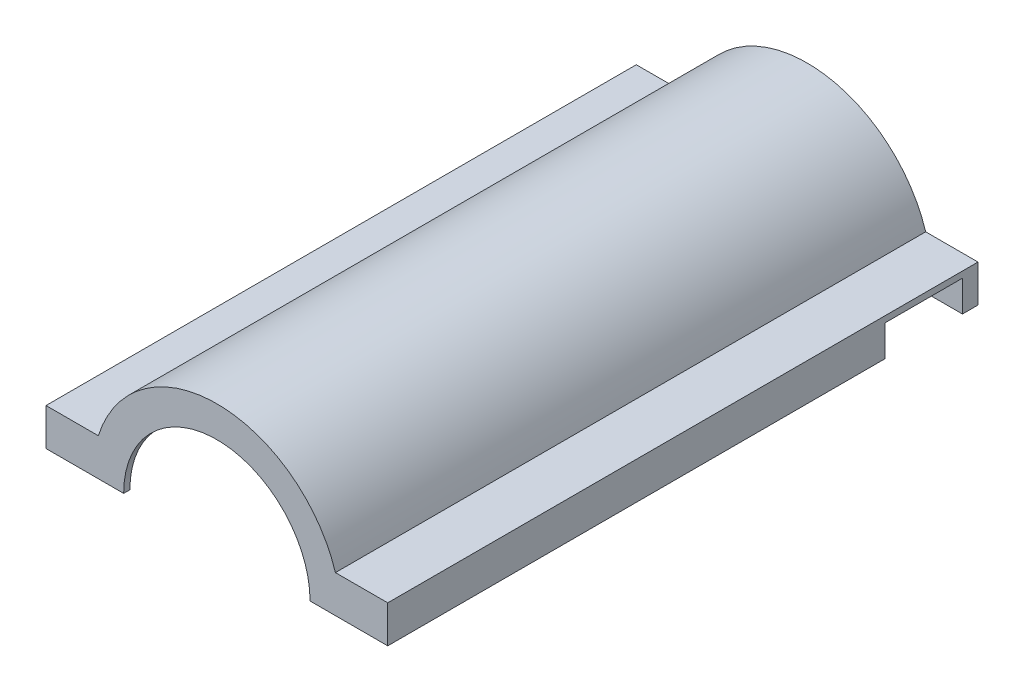
ISO-10303-21;
HEADER;
FILE_DESCRIPTION(('STEP AP214'),'2;1');
FILE_NAME('part.step','',(''),(''),'','','');
FILE_SCHEMA(('AUTOMOTIVE_DESIGN { 1 0 10303 214 1 1 1 1 }'));
ENDSEC;
DATA;
#1=APPLICATION_CONTEXT('core data for automotive mechanical design processes');
#2=APPLICATION_PROTOCOL_DEFINITION('international standard','automotive_design',2000,#1);
#3=PRODUCT_CONTEXT('',#1,'mechanical');
#4=PRODUCT('Part','Part','',(#3));
#5=PRODUCT_RELATED_PRODUCT_CATEGORY('part','',(#4));
#6=PRODUCT_DEFINITION_FORMATION('','',#4);
#7=PRODUCT_DEFINITION_CONTEXT('part definition',#1,'design');
#8=PRODUCT_DEFINITION('design','',#6,#7);
#9=PRODUCT_DEFINITION_SHAPE('','',#8);
#10=(LENGTH_UNIT() NAMED_UNIT(*) SI_UNIT(.MILLI.,.METRE.));
#11=(NAMED_UNIT(*) PLANE_ANGLE_UNIT() SI_UNIT($,.RADIAN.));
#12=(NAMED_UNIT(*) SI_UNIT($,.STERADIAN.) SOLID_ANGLE_UNIT());
#13=UNCERTAINTY_MEASURE_WITH_UNIT(LENGTH_MEASURE(1.E-05),#10,'distance_accuracy_value','');
#14=(GEOMETRIC_REPRESENTATION_CONTEXT(3) GLOBAL_UNCERTAINTY_ASSIGNED_CONTEXT((#13)) GLOBAL_UNIT_ASSIGNED_CONTEXT((#10,
#11,#12)) REPRESENTATION_CONTEXT('',''));
#15=CARTESIAN_POINT('',(0.,0.,0.));
#16=DIRECTION('',(0.,0.,1.));
#17=DIRECTION('',(1.,0.,0.));
#18=AXIS2_PLACEMENT_3D('',#15,#16,#17);
#19=CARTESIAN_POINT('',(0.,0.,1900.));
#20=DIRECTION('',(0.,1.,0.));
#21=DIRECTION('',(0.,0.,1.));
#22=AXIS2_PLACEMENT_3D('',#19,#20,#21);
#23=PLANE('',#22);
#24=DIRECTION('',(1.,0.,0.));
#25=VECTOR('',#24,1.);
#26=CARTESIAN_POINT('',(0.,0.,20.));
#27=LINE('',#26,#25);
#28=CARTESIAN_POINT('',(20.,0.,20.));
#29=VERTEX_POINT('',#28);
#30=CARTESIAN_POINT('',(250.,0.,20.));
#31=VERTEX_POINT('',#30);
#32=EDGE_CURVE('E48',#29,#31,#27,.T.);
#33=ORIENTED_EDGE('',*,*,#32,.F.);
#34=DIRECTION('',(0.,0.,-1.));
#35=VECTOR('',#34,1.);
#36=CARTESIAN_POINT('',(20.,0.,1900.));
#37=LINE('',#36,#35);
#38=CARTESIAN_POINT('',(20.,0.,1880.));
#39=VERTEX_POINT('',#38);
#40=EDGE_CURVE('E230',#39,#29,#37,.T.);
#41=ORIENTED_EDGE('',*,*,#40,.F.);
#42=DIRECTION('',(1.,0.,0.));
#43=VECTOR('',#42,1.);
#44=CARTESIAN_POINT('',(0.,0.,1880.));
#45=LINE('',#44,#43);
#46=CARTESIAN_POINT('',(250.,0.,1880.));
#47=VERTEX_POINT('',#46);
#48=EDGE_CURVE('E267',#39,#47,#45,.T.);
#49=ORIENTED_EDGE('',*,*,#48,.T.);
#50=DIRECTION('',(0.,0.,1.));
#51=VECTOR('',#50,1.);
#52=CARTESIAN_POINT('',(250.,0.,0.));
#53=LINE('',#52,#51);
#54=CARTESIAN_POINT('',(250.,0.,1900.));
#55=VERTEX_POINT('',#54);
#56=EDGE_CURVE('E339',#47,#55,#53,.T.);
#57=ORIENTED_EDGE('',*,*,#56,.T.);
#58=DIRECTION('',(1.,0.,0.));
#59=VECTOR('',#58,1.);
#60=CARTESIAN_POINT('',(0.,0.,1900.));
#61=LINE('',#60,#59);
#62=CARTESIAN_POINT('',(0.,0.,1900.));
#63=VERTEX_POINT('',#62);
#64=EDGE_CURVE('E351',#63,#55,#61,.T.);
#65=ORIENTED_EDGE('',*,*,#64,.F.);
#66=DIRECTION('',(0.,0.,-1.));
#67=VECTOR('',#66,1.);
#68=CARTESIAN_POINT('',(0.,0.,1900.));
#69=LINE('',#68,#67);
#70=CARTESIAN_POINT('',(0.,0.,0.));
#71=VERTEX_POINT('',#70);
#72=EDGE_CURVE('E391',#63,#71,#69,.T.);
#73=ORIENTED_EDGE('',*,*,#72,.T.);
#74=DIRECTION('',(1.,0.,0.));
#75=VECTOR('',#74,1.);
#76=CARTESIAN_POINT('',(0.,0.,0.));
#77=LINE('',#76,#75);
#78=CARTESIAN_POINT('',(250.,0.,0.));
#79=VERTEX_POINT('',#78);
#80=EDGE_CURVE('E366',#71,#79,#77,.T.);
#81=ORIENTED_EDGE('',*,*,#80,.T.);
#82=EDGE_CURVE('E342',#79,#31,#53,.T.);
#83=ORIENTED_EDGE('',*,*,#82,.T.);
#84=EDGE_LOOP('',(#33,#41,#49,#57,#65,#73,#81,#83));
#85=FACE_BOUND('',#84,.T.);
#86=ADVANCED_FACE('F33',(#85),#23,.F.);
#87=DIRECTION('',(1.,0.,0.));
#88=VECTOR('',#87,1.);
#89=CARTESIAN_POINT('',(0.,0.,320.));
#90=LINE('',#89,#88);
#91=CARTESIAN_POINT('',(850.,0.,320.));
#92=VERTEX_POINT('',#91);
#93=CARTESIAN_POINT('',(1080.,0.,320.));
#94=VERTEX_POINT('',#93);
#95=EDGE_CURVE('E275',#92,#94,#90,.T.);
#96=ORIENTED_EDGE('',*,*,#95,.F.);
#97=DIRECTION('',(0.,0.,1.));
#98=VECTOR('',#97,1.);
#99=CARTESIAN_POINT('',(850.,0.,0.));
#100=LINE('',#99,#98);
#101=CARTESIAN_POINT('',(850.,0.,300.));
#102=VERTEX_POINT('',#101);
#103=EDGE_CURVE('E340',#92,#102,#100,.F.);
#104=ORIENTED_EDGE('',*,*,#103,.T.);
#105=DIRECTION('',(1.,0.,0.));
#106=VECTOR('',#105,1.);
#107=CARTESIAN_POINT('',(550.,0.,300.));
#108=LINE('',#107,#106);
#109=CARTESIAN_POINT('',(1100.,0.,300.));
#110=VERTEX_POINT('',#109);
#111=EDGE_CURVE('E325',#102,#110,#108,.T.);
#112=ORIENTED_EDGE('',*,*,#111,.T.);
#113=DIRECTION('',(0.,0.,-1.));
#114=VECTOR('',#113,1.);
#115=CARTESIAN_POINT('',(1100.,0.,1900.));
#116=LINE('',#115,#114);
#117=CARTESIAN_POINT('',(1100.,0.,1900.));
#118=VERTEX_POINT('',#117);
#119=EDGE_CURVE('E388',#118,#110,#116,.T.);
#120=ORIENTED_EDGE('',*,*,#119,.F.);
#121=CARTESIAN_POINT('',(850.,0.,1900.));
#122=VERTEX_POINT('',#121);
#123=EDGE_CURVE('E349',#122,#118,#61,.T.);
#124=ORIENTED_EDGE('',*,*,#123,.F.);
#125=CARTESIAN_POINT('',(850.,0.,1880.));
#126=VERTEX_POINT('',#125);
#127=EDGE_CURVE('E336',#122,#126,#100,.F.);
#128=ORIENTED_EDGE('',*,*,#127,.T.);
#129=DIRECTION('',(1.,0.,0.));
#130=VECTOR('',#129,1.);
#131=CARTESIAN_POINT('',(0.,0.,1880.));
#132=LINE('',#131,#130);
#133=CARTESIAN_POINT('',(1080.,0.,1880.));
#134=VERTEX_POINT('',#133);
#135=EDGE_CURVE('E238',#126,#134,#132,.T.);
#136=ORIENTED_EDGE('',*,*,#135,.T.);
#137=DIRECTION('',(0.,0.,-1.));
#138=VECTOR('',#137,1.);
#139=CARTESIAN_POINT('',(1080.,0.,1900.));
#140=LINE('',#139,#138);
#141=EDGE_CURVE('E278',#134,#94,#140,.T.);
#142=ORIENTED_EDGE('',*,*,#141,.T.);
#143=EDGE_LOOP('',(#96,#104,#112,#120,#124,#128,#136,#142));
#144=FACE_BOUND('',#143,.T.);
#145=ADVANCED_FACE('F409',(#144),#23,.F.);
#146=CARTESIAN_POINT('',(550.,0.,0.));
#147=DIRECTION('',(0.,0.,1.));
#148=DIRECTION('',(1.,0.,0.));
#149=AXIS2_PLACEMENT_3D('',#146,#147,#148);
#150=CYLINDRICAL_SURFACE('',#149,300.);
#151=CARTESIAN_POINT('',(550.,0.,30.));
#152=DIRECTION('',(0.,0.,-1.));
#153=DIRECTION('',(0.,1.,0.));
#154=AXIS2_PLACEMENT_3D('',#151,#152,#153);
#155=CIRCLE('',#154,300.);
#156=CARTESIAN_POINT('',(850.,0.,30.));
#157=VERTEX_POINT('',#156);
#158=CARTESIAN_POINT('',(824.95454169735,120.,30.));
#159=VERTEX_POINT('',#158);
#160=EDGE_CURVE('E285',#157,#159,#155,.F.);
#161=ORIENTED_EDGE('',*,*,#160,.F.);
#162=CARTESIAN_POINT('',(850.,0.,50.));
#163=VERTEX_POINT('',#162);
#164=EDGE_CURVE('E341',#163,#157,#100,.F.);
#165=ORIENTED_EDGE('',*,*,#164,.F.);
#166=CARTESIAN_POINT('',(550.,0.,50.));
#167=DIRECTION('',(0.,0.,-1.));
#168=DIRECTION('',(0.,1.,0.));
#169=AXIS2_PLACEMENT_3D('',#166,#167,#168);
#170=CIRCLE('',#169,300.);
#171=CARTESIAN_POINT('',(832.842712474619,100.,50.));
#172=VERTEX_POINT('',#171);
#173=EDGE_CURVE('E11',#163,#172,#170,.F.);
#174=ORIENTED_EDGE('',*,*,#173,.T.);
#175=DIRECTION('',(0.,0.,1.));
#176=VECTOR('',#175,1.);
#177=CARTESIAN_POINT('',(832.842712474619,100.,0.));
#178=LINE('',#177,#176);
#179=CARTESIAN_POINT('',(832.842712474619,100.,300.));
#180=VERTEX_POINT('',#179);
#181=EDGE_CURVE('E394',#172,#180,#178,.T.);
#182=ORIENTED_EDGE('',*,*,#181,.T.);
#183=CARTESIAN_POINT('',(550.,0.,300.));
#184=DIRECTION('',(0.,0.,1.));
#185=DIRECTION('',(1.,0.,0.));
#186=AXIS2_PLACEMENT_3D('',#183,#184,#185);
#187=CIRCLE('',#186,300.);
#188=EDGE_CURVE('E41',#180,#102,#187,.F.);
#189=ORIENTED_EDGE('',*,*,#188,.T.);
#190=ORIENTED_EDGE('',*,*,#103,.F.);
#191=CARTESIAN_POINT('',(550.,0.,320.));
#192=DIRECTION('',(0.,0.,1.));
#193=DIRECTION('',(1.,0.,0.));
#194=AXIS2_PLACEMENT_3D('',#191,#192,#193);
#195=CIRCLE('',#194,300.);
#196=CARTESIAN_POINT('',(824.95454169735,120.,320.));
#197=VERTEX_POINT('',#196);
#198=EDGE_CURVE('E289',#197,#92,#195,.F.);
#199=ORIENTED_EDGE('',*,*,#198,.F.);
#200=DIRECTION('',(0.,0.,1.));
#201=VECTOR('',#200,1.);
#202=CARTESIAN_POINT('',(824.95454169735,120.,30.));
#203=LINE('',#202,#201);
#204=EDGE_CURVE('E277',#159,#197,#203,.T.);
#205=ORIENTED_EDGE('',*,*,#204,.F.);
#206=EDGE_LOOP('',(#161,#165,#174,#182,#189,#190,#199,#205));
#207=FACE_BOUND('',#206,.T.);
#208=ADVANCED_FACE('F400',(#207),#150,.F.);
#209=CARTESIAN_POINT('',(550.,0.,1880.));
#210=DIRECTION('',(0.,0.,1.));
#211=DIRECTION('',(1.,0.,0.));
#212=AXIS2_PLACEMENT_3D('',#209,#210,#211);
#213=CIRCLE('',#212,300.);
#214=EDGE_CURVE('E235',#126,#47,#213,.T.);
#215=ORIENTED_EDGE('',*,*,#214,.F.);
#216=ORIENTED_EDGE('',*,*,#127,.F.);
#217=CARTESIAN_POINT('',(550.,0.,1900.));
#218=DIRECTION('',(0.,0.,1.));
#219=DIRECTION('',(1.,0.,0.));
#220=AXIS2_PLACEMENT_3D('',#217,#218,#219);
#221=CIRCLE('',#220,300.);
#222=EDGE_CURVE('E324',#122,#55,#221,.T.);
#223=ORIENTED_EDGE('',*,*,#222,.T.);
#224=ORIENTED_EDGE('',*,*,#56,.F.);
#225=EDGE_LOOP('',(#215,#216,#223,#224));
#226=FACE_BOUND('',#225,.T.);
#227=ADVANCED_FACE('F423',(#226),#150,.F.);
#228=ORIENTED_EDGE('',*,*,#164,.T.);
#229=DIRECTION('',(1.,0.,0.));
#230=VECTOR('',#229,1.);
#231=CARTESIAN_POINT('',(550.,0.,30.));
#232=LINE('',#231,#230);
#233=CARTESIAN_POINT('',(1080.,0.,30.));
#234=VERTEX_POINT('',#233);
#235=EDGE_CURVE('E282',#157,#234,#232,.T.);
#236=ORIENTED_EDGE('',*,*,#235,.T.);
#237=DIRECTION('',(0.,0.,-1.));
#238=VECTOR('',#237,1.);
#239=CARTESIAN_POINT('',(1080.,0.,1900.));
#240=LINE('',#239,#238);
#241=CARTESIAN_POINT('',(1080.,0.,20.));
#242=VERTEX_POINT('',#241);
#243=EDGE_CURVE('E259',#234,#242,#240,.T.);
#244=ORIENTED_EDGE('',*,*,#243,.T.);
#245=DIRECTION('',(1.,0.,0.));
#246=VECTOR('',#245,1.);
#247=CARTESIAN_POINT('',(0.,0.,20.));
#248=LINE('',#247,#246);
#249=CARTESIAN_POINT('',(850.,0.,20.));
#250=VERTEX_POINT('',#249);
#251=EDGE_CURVE('E231',#250,#242,#248,.T.);
#252=ORIENTED_EDGE('',*,*,#251,.F.);
#253=CARTESIAN_POINT('',(850.,0.,0.));
#254=VERTEX_POINT('',#253);
#255=EDGE_CURVE('E333',#250,#254,#100,.F.);
#256=ORIENTED_EDGE('',*,*,#255,.T.);
#257=CARTESIAN_POINT('',(1100.,0.,0.));
#258=VERTEX_POINT('',#257);
#259=EDGE_CURVE('E365',#254,#258,#77,.T.);
#260=ORIENTED_EDGE('',*,*,#259,.T.);
#261=CARTESIAN_POINT('',(1100.,0.,50.));
#262=VERTEX_POINT('',#261);
#263=EDGE_CURVE('E387',#262,#258,#116,.T.);
#264=ORIENTED_EDGE('',*,*,#263,.F.);
#265=DIRECTION('',(1.,0.,0.));
#266=VECTOR('',#265,1.);
#267=CARTESIAN_POINT('',(550.,0.,50.));
#268=LINE('',#267,#266);
#269=EDGE_CURVE('E322',#163,#262,#268,.T.);
#270=ORIENTED_EDGE('',*,*,#269,.F.);
#271=EDGE_LOOP('',(#228,#236,#244,#252,#256,#260,#264,#270));
#272=FACE_BOUND('',#271,.T.);
#273=ADVANCED_FACE('F443',(#272),#23,.F.);
#274=CARTESIAN_POINT('',(0.,0.,1900.));
#275=DIRECTION('',(1.,0.,0.));
#276=DIRECTION('',(0.,0.,-1.));
#277=AXIS2_PLACEMENT_3D('',#274,#275,#276);
#278=PLANE('',#277);
#279=DIRECTION('',(0.,-1.,0.));
#280=VECTOR('',#279,1.);
#281=CARTESIAN_POINT('',(0.,0.,0.));
#282=LINE('',#281,#280);
#283=CARTESIAN_POINT('',(0.,120.,0.));
#284=VERTEX_POINT('',#283);
#285=EDGE_CURVE('E345',#284,#71,#282,.T.);
#286=ORIENTED_EDGE('',*,*,#285,.T.);
#287=ORIENTED_EDGE('',*,*,#72,.F.);
#288=DIRECTION('',(0.,-1.,0.));
#289=VECTOR('',#288,1.);
#290=CARTESIAN_POINT('',(0.,0.,1900.));
#291=LINE('',#290,#289);
#292=CARTESIAN_POINT('',(0.,120.,1900.));
#293=VERTEX_POINT('',#292);
#294=EDGE_CURVE('E346',#293,#63,#291,.T.);
#295=ORIENTED_EDGE('',*,*,#294,.F.);
#296=DIRECTION('',(0.,0.,-1.));
#297=VECTOR('',#296,1.);
#298=CARTESIAN_POINT('',(0.,120.,1900.));
#299=LINE('',#298,#297);
#300=EDGE_CURVE('E362',#293,#284,#299,.T.);
#301=ORIENTED_EDGE('',*,*,#300,.T.);
#302=EDGE_LOOP('',(#286,#287,#295,#301));
#303=FACE_BOUND('',#302,.T.);
#304=ADVANCED_FACE('F35',(#303),#278,.F.);
#305=CARTESIAN_POINT('',(1100.,0.,1900.));
#306=DIRECTION('',(-1.,0.,0.));
#307=DIRECTION('',(0.,0.,1.));
#308=AXIS2_PLACEMENT_3D('',#305,#306,#307);
#309=PLANE('',#308);
#310=DIRECTION('',(0.,0.,1.));
#311=VECTOR('',#310,1.);
#312=CARTESIAN_POINT('',(1100.,100.,50.));
#313=LINE('',#312,#311);
#314=CARTESIAN_POINT('',(1100.,100.,50.));
#315=VERTEX_POINT('',#314);
#316=CARTESIAN_POINT('',(1100.,100.,300.));
#317=VERTEX_POINT('',#316);
#318=EDGE_CURVE('E317',#315,#317,#313,.T.);
#319=ORIENTED_EDGE('',*,*,#318,.F.);
#320=DIRECTION('',(0.,1.,0.));
#321=VECTOR('',#320,1.);
#322=CARTESIAN_POINT('',(1100.,0.,50.));
#323=LINE('',#322,#321);
#324=EDGE_CURVE('E314',#262,#315,#323,.T.);
#325=ORIENTED_EDGE('',*,*,#324,.F.);
#326=ORIENTED_EDGE('',*,*,#263,.T.);
#327=DIRECTION('',(0.,1.,0.));
#328=VECTOR('',#327,1.);
#329=CARTESIAN_POINT('',(1100.,0.,0.));
#330=LINE('',#329,#328);
#331=CARTESIAN_POINT('',(1100.,120.,0.));
#332=VERTEX_POINT('',#331);
#333=EDGE_CURVE('E369',#258,#332,#330,.T.);
#334=ORIENTED_EDGE('',*,*,#333,.T.);
#335=DIRECTION('',(0.,0.,-1.));
#336=VECTOR('',#335,1.);
#337=CARTESIAN_POINT('',(1100.,120.,1900.));
#338=LINE('',#337,#336);
#339=CARTESIAN_POINT('',(1100.,120.,1900.));
#340=VERTEX_POINT('',#339);
#341=EDGE_CURVE('E384',#340,#332,#338,.T.);
#342=ORIENTED_EDGE('',*,*,#341,.F.);
#343=DIRECTION('',(0.,1.,0.));
#344=VECTOR('',#343,1.);
#345=CARTESIAN_POINT('',(1100.,0.,1900.));
#346=LINE('',#345,#344);
#347=EDGE_CURVE('E354',#118,#340,#346,.T.);
#348=ORIENTED_EDGE('',*,*,#347,.F.);
#349=ORIENTED_EDGE('',*,*,#119,.T.);
#350=DIRECTION('',(0.,-1.,0.));
#351=VECTOR('',#350,1.);
#352=CARTESIAN_POINT('',(1100.,0.,300.));
#353=LINE('',#352,#351);
#354=EDGE_CURVE('E319',#317,#110,#353,.T.);
#355=ORIENTED_EDGE('',*,*,#354,.F.);
#356=EDGE_LOOP('',(#319,#325,#326,#334,#342,#348,#349,#355));
#357=FACE_BOUND('',#356,.T.);
#358=ADVANCED_FACE('F414',(#357),#309,.F.);
#359=CARTESIAN_POINT('',(931.575680566778,120.,1900.));
#360=DIRECTION('',(0.,-1.,0.));
#361=DIRECTION('',(0.,0.,-1.));
#362=AXIS2_PLACEMENT_3D('',#359,#360,#361);
#363=PLANE('',#362);
#364=DIRECTION('',(-1.,0.,0.));
#365=VECTOR('',#364,1.);
#366=CARTESIAN_POINT('',(931.575680566778,120.,0.));
#367=LINE('',#366,#365);
#368=CARTESIAN_POINT('',(931.575680566778,120.,0.));
#369=VERTEX_POINT('',#368);
#370=EDGE_CURVE('E371',#332,#369,#367,.T.);
#371=ORIENTED_EDGE('',*,*,#370,.T.);
#372=DIRECTION('',(0.,0.,-1.));
#373=VECTOR('',#372,1.);
#374=CARTESIAN_POINT('',(931.575680566778,120.,1900.));
#375=LINE('',#374,#373);
#376=CARTESIAN_POINT('',(931.575680566778,120.,1900.));
#377=VERTEX_POINT('',#376);
#378=EDGE_CURVE('E381',#377,#369,#375,.T.);
#379=ORIENTED_EDGE('',*,*,#378,.F.);
#380=DIRECTION('',(-1.,0.,0.));
#381=VECTOR('',#380,1.);
#382=CARTESIAN_POINT('',(931.575680566778,120.,1900.));
#383=LINE('',#382,#381);
#384=EDGE_CURVE('E356',#340,#377,#383,.T.);
#385=ORIENTED_EDGE('',*,*,#384,.F.);
#386=ORIENTED_EDGE('',*,*,#341,.T.);
#387=EDGE_LOOP('',(#371,#379,#385,#386));
#388=FACE_BOUND('',#387,.T.);
#389=ADVANCED_FACE('F520',(#388),#363,.F.);
#390=CARTESIAN_POINT('',(550.,0.,1900.));
#391=DIRECTION('',(0.,0.,-1.));
#392=DIRECTION('',(-1.,0.,0.));
#393=AXIS2_PLACEMENT_3D('',#390,#391,#392);
#394=CYLINDRICAL_SURFACE('',#393,400.);
#395=CARTESIAN_POINT('',(550.,0.,0.));
#396=DIRECTION('',(0.,0.,1.));
#397=DIRECTION('',(1.,0.,0.));
#398=AXIS2_PLACEMENT_3D('',#395,#396,#397);
#399=CIRCLE('',#398,400.);
#400=CARTESIAN_POINT('',(168.424319433222,120.,0.));
#401=VERTEX_POINT('',#400);
#402=EDGE_CURVE('E373',#369,#401,#399,.T.);
#403=ORIENTED_EDGE('',*,*,#402,.T.);
#404=DIRECTION('',(0.,0.,-1.));
#405=VECTOR('',#404,1.);
#406=CARTESIAN_POINT('',(168.424319433222,120.,1900.));
#407=LINE('',#406,#405);
#408=CARTESIAN_POINT('',(168.424319433222,120.,1900.));
#409=VERTEX_POINT('',#408);
#410=EDGE_CURVE('E378',#409,#401,#407,.T.);
#411=ORIENTED_EDGE('',*,*,#410,.F.);
#412=CARTESIAN_POINT('',(550.,0.,1900.));
#413=DIRECTION('',(0.,0.,1.));
#414=DIRECTION('',(1.,0.,0.));
#415=AXIS2_PLACEMENT_3D('',#412,#413,#414);
#416=CIRCLE('',#415,400.);
#417=EDGE_CURVE('E358',#377,#409,#416,.T.);
#418=ORIENTED_EDGE('',*,*,#417,.F.);
#419=ORIENTED_EDGE('',*,*,#378,.T.);
#420=EDGE_LOOP('',(#403,#411,#418,#419));
#421=FACE_BOUND('',#420,.T.);
#422=ADVANCED_FACE('F516',(#421),#394,.T.);
#423=CARTESIAN_POINT('',(0.,120.,1900.));
#424=DIRECTION('',(0.,-1.,0.));
#425=DIRECTION('',(0.,0.,-1.));
#426=AXIS2_PLACEMENT_3D('',#423,#424,#425);
#427=PLANE('',#426);
#428=DIRECTION('',(-1.,0.,0.));
#429=VECTOR('',#428,1.);
#430=CARTESIAN_POINT('',(0.,120.,0.));
#431=LINE('',#430,#429);
#432=EDGE_CURVE('E350',#401,#284,#431,.T.);
#433=ORIENTED_EDGE('',*,*,#432,.T.);
#434=ORIENTED_EDGE('',*,*,#300,.F.);
#435=DIRECTION('',(-1.,0.,0.));
#436=VECTOR('',#435,1.);
#437=CARTESIAN_POINT('',(0.,120.,1900.));
#438=LINE('',#437,#436);
#439=EDGE_CURVE('E360',#409,#293,#438,.T.);
#440=ORIENTED_EDGE('',*,*,#439,.F.);
#441=ORIENTED_EDGE('',*,*,#410,.T.);
#442=EDGE_LOOP('',(#433,#434,#440,#441));
#443=FACE_BOUND('',#442,.T.);
#444=ADVANCED_FACE('F512',(#443),#427,.F.);
#445=CARTESIAN_POINT('',(550.,0.,1900.));
#446=DIRECTION('',(0.,0.,1.));
#447=DIRECTION('',(1.,0.,0.));
#448=AXIS2_PLACEMENT_3D('',#445,#446,#447);
#449=PLANE('',#448);
#450=ORIENTED_EDGE('',*,*,#222,.F.);
#451=ORIENTED_EDGE('',*,*,#123,.T.);
#452=ORIENTED_EDGE('',*,*,#347,.T.);
#453=ORIENTED_EDGE('',*,*,#384,.T.);
#454=ORIENTED_EDGE('',*,*,#417,.T.);
#455=ORIENTED_EDGE('',*,*,#439,.T.);
#456=ORIENTED_EDGE('',*,*,#294,.T.);
#457=ORIENTED_EDGE('',*,*,#64,.T.);
#458=EDGE_LOOP('',(#450,#451,#452,#453,#454,#455,#456,#457));
#459=FACE_BOUND('',#458,.T.);
#460=ADVANCED_FACE('F419',(#459),#449,.T.);
#461=CARTESIAN_POINT('',(550.,0.,0.));
#462=DIRECTION('',(0.,0.,1.));
#463=DIRECTION('',(1.,0.,0.));
#464=AXIS2_PLACEMENT_3D('',#461,#462,#463);
#465=PLANE('',#464);
#466=ORIENTED_EDGE('',*,*,#259,.F.);
#467=CARTESIAN_POINT('',(550.,0.,0.));
#468=DIRECTION('',(0.,0.,1.));
#469=DIRECTION('',(1.,0.,0.));
#470=AXIS2_PLACEMENT_3D('',#467,#468,#469);
#471=CIRCLE('',#470,300.);
#472=EDGE_CURVE('E330',#254,#79,#471,.T.);
#473=ORIENTED_EDGE('',*,*,#472,.T.);
#474=ORIENTED_EDGE('',*,*,#80,.F.);
#475=ORIENTED_EDGE('',*,*,#285,.F.);
#476=ORIENTED_EDGE('',*,*,#432,.F.);
#477=ORIENTED_EDGE('',*,*,#402,.F.);
#478=ORIENTED_EDGE('',*,*,#370,.F.);
#479=ORIENTED_EDGE('',*,*,#333,.F.);
#480=EDGE_LOOP('',(#466,#473,#474,#475,#476,#477,#478,#479));
#481=FACE_BOUND('',#480,.T.);
#482=ADVANCED_FACE('F435',(#481),#465,.F.);
#483=ORIENTED_EDGE('',*,*,#255,.F.);
#484=CARTESIAN_POINT('',(550.,0.,20.));
#485=DIRECTION('',(0.,0.,1.));
#486=DIRECTION('',(1.,0.,0.));
#487=AXIS2_PLACEMENT_3D('',#484,#485,#486);
#488=CIRCLE('',#487,300.);
#489=EDGE_CURVE('E232',#250,#31,#488,.T.);
#490=ORIENTED_EDGE('',*,*,#489,.T.);
#491=ORIENTED_EDGE('',*,*,#82,.F.);
#492=ORIENTED_EDGE('',*,*,#472,.F.);
#493=EDGE_LOOP('',(#483,#490,#491,#492));
#494=FACE_BOUND('',#493,.T.);
#495=ADVANCED_FACE('F432',(#494),#150,.F.);
#496=CARTESIAN_POINT('',(550.,0.,50.));
#497=DIRECTION('',(0.,0.,-1.));
#498=DIRECTION('',(0.,1.,0.));
#499=AXIS2_PLACEMENT_3D('',#496,#497,#498);
#500=PLANE('',#499);
#501=ORIENTED_EDGE('',*,*,#269,.T.);
#502=ORIENTED_EDGE('',*,*,#324,.T.);
#503=DIRECTION('',(1.,0.,0.));
#504=VECTOR('',#503,1.);
#505=CARTESIAN_POINT('',(550.,100.,50.));
#506=LINE('',#505,#504);
#507=EDGE_CURVE('E321',#172,#315,#506,.T.);
#508=ORIENTED_EDGE('',*,*,#507,.F.);
#509=ORIENTED_EDGE('',*,*,#173,.F.);
#510=EDGE_LOOP('',(#501,#502,#508,#509));
#511=FACE_BOUND('',#510,.T.);
#512=ADVANCED_FACE('F502',(#511),#500,.F.);
#513=CARTESIAN_POINT('',(550.,0.,300.));
#514=DIRECTION('',(0.,0.,1.));
#515=DIRECTION('',(1.,0.,0.));
#516=AXIS2_PLACEMENT_3D('',#513,#514,#515);
#517=PLANE('',#516);
#518=DIRECTION('',(1.,0.,0.));
#519=VECTOR('',#518,1.);
#520=CARTESIAN_POINT('',(550.,100.,300.));
#521=LINE('',#520,#519);
#522=EDGE_CURVE('E56',#180,#317,#521,.T.);
#523=ORIENTED_EDGE('',*,*,#522,.T.);
#524=ORIENTED_EDGE('',*,*,#354,.T.);
#525=ORIENTED_EDGE('',*,*,#111,.F.);
#526=ORIENTED_EDGE('',*,*,#188,.F.);
#527=EDGE_LOOP('',(#523,#524,#525,#526));
#528=FACE_BOUND('',#527,.T.);
#529=ADVANCED_FACE('F404',(#528),#517,.F.);
#530=CARTESIAN_POINT('',(550.,100.,50.));
#531=DIRECTION('',(0.,1.,0.));
#532=DIRECTION('',(0.,0.,1.));
#533=AXIS2_PLACEMENT_3D('',#530,#531,#532);
#534=PLANE('',#533);
#535=ORIENTED_EDGE('',*,*,#507,.T.);
#536=ORIENTED_EDGE('',*,*,#318,.T.);
#537=ORIENTED_EDGE('',*,*,#522,.F.);
#538=ORIENTED_EDGE('',*,*,#181,.F.);
#539=EDGE_LOOP('',(#535,#536,#537,#538));
#540=FACE_BOUND('',#539,.T.);
#541=ADVANCED_FACE('F475',(#540),#534,.F.);
#542=CARTESIAN_POINT('',(550.,120.,50.));
#543=DIRECTION('',(0.,1.,0.));
#544=DIRECTION('',(0.,0.,1.));
#545=AXIS2_PLACEMENT_3D('',#542,#543,#544);
#546=PLANE('',#545);
#547=DIRECTION('',(0.,0.,-1.));
#548=VECTOR('',#547,1.);
#549=CARTESIAN_POINT('',(910.555127546399,120.,1900.));
#550=LINE('',#549,#548);
#551=CARTESIAN_POINT('',(910.555127546399,120.,320.));
#552=VERTEX_POINT('',#551);
#553=CARTESIAN_POINT('',(910.555127546399,120.,30.));
#554=VERTEX_POINT('',#553);
#555=EDGE_CURVE('E311',#552,#554,#550,.T.);
#556=ORIENTED_EDGE('',*,*,#555,.T.);
#557=DIRECTION('',(1.,0.,0.));
#558=VECTOR('',#557,1.);
#559=CARTESIAN_POINT('',(550.,120.,30.));
#560=LINE('',#559,#558);
#561=EDGE_CURVE('E269',#159,#554,#560,.T.);
#562=ORIENTED_EDGE('',*,*,#561,.F.);
#563=ORIENTED_EDGE('',*,*,#204,.T.);
#564=DIRECTION('',(1.,0.,0.));
#565=VECTOR('',#564,1.);
#566=CARTESIAN_POINT('',(550.,120.,320.));
#567=LINE('',#566,#565);
#568=EDGE_CURVE('E272',#197,#552,#567,.T.);
#569=ORIENTED_EDGE('',*,*,#568,.T.);
#570=EDGE_LOOP('',(#556,#562,#563,#569));
#571=FACE_BOUND('',#570,.T.);
#572=ADVANCED_FACE('F473',(#571),#546,.T.);
#573=CARTESIAN_POINT('',(550.,0.,320.));
#574=DIRECTION('',(0.,0.,1.));
#575=DIRECTION('',(1.,0.,0.));
#576=AXIS2_PLACEMENT_3D('',#573,#574,#575);
#577=PLANE('',#576);
#578=CARTESIAN_POINT('',(550.,0.,320.));
#579=DIRECTION('',(0.,0.,1.));
#580=DIRECTION('',(1.,0.,0.));
#581=AXIS2_PLACEMENT_3D('',#578,#579,#580);
#582=CIRCLE('',#581,380.);
#583=CARTESIAN_POINT('',(916.606055596467,100.,320.000000000001));
#584=VERTEX_POINT('',#583);
#585=EDGE_CURVE('E309',#584,#552,#582,.T.);
#586=ORIENTED_EDGE('',*,*,#585,.T.);
#587=ORIENTED_EDGE('',*,*,#568,.F.);
#588=ORIENTED_EDGE('',*,*,#198,.T.);
#589=ORIENTED_EDGE('',*,*,#95,.T.);
#590=DIRECTION('',(0.,-1.,0.));
#591=VECTOR('',#590,1.);
#592=CARTESIAN_POINT('',(1080.,0.,320.));
#593=LINE('',#592,#591);
#594=CARTESIAN_POINT('',(1080.,100.,320.));
#595=VERTEX_POINT('',#594);
#596=EDGE_CURVE('E263',#595,#94,#593,.T.);
#597=ORIENTED_EDGE('',*,*,#596,.F.);
#598=DIRECTION('',(-1.,0.,0.));
#599=VECTOR('',#598,1.);
#600=CARTESIAN_POINT('',(931.575680566778,100.,320.));
#601=LINE('',#600,#599);
#602=EDGE_CURVE('E304',#595,#584,#601,.T.);
#603=ORIENTED_EDGE('',*,*,#602,.T.);
#604=EDGE_LOOP('',(#586,#587,#588,#589,#597,#603));
#605=FACE_BOUND('',#604,.T.);
#606=ADVANCED_FACE('F469',(#605),#577,.T.);
#607=CARTESIAN_POINT('',(931.575680566778,100.,1900.));
#608=DIRECTION('',(0.,-1.,0.));
#609=DIRECTION('',(0.,0.,-1.));
#610=AXIS2_PLACEMENT_3D('',#607,#608,#609);
#611=PLANE('',#610);
#612=DIRECTION('',(0.,0.,-1.));
#613=VECTOR('',#612,1.);
#614=CARTESIAN_POINT('',(1080.,100.,1900.));
#615=LINE('',#614,#613);
#616=CARTESIAN_POINT('',(1080.,100.,1880.));
#617=VERTEX_POINT('',#616);
#618=EDGE_CURVE('E251',#617,#595,#615,.T.);
#619=ORIENTED_EDGE('',*,*,#618,.F.);
#620=DIRECTION('',(-1.,0.,0.));
#621=VECTOR('',#620,1.);
#622=CARTESIAN_POINT('',(931.575680566778,100.,1880.));
#623=LINE('',#622,#621);
#624=CARTESIAN_POINT('',(916.606055596467,100.,1880.));
#625=VERTEX_POINT('',#624);
#626=EDGE_CURVE('E247',#617,#625,#623,.T.);
#627=ORIENTED_EDGE('',*,*,#626,.T.);
#628=DIRECTION('',(0.,0.,-1.));
#629=VECTOR('',#628,1.);
#630=CARTESIAN_POINT('',(916.606055596467,100.,1880.));
#631=LINE('',#630,#629);
#632=EDGE_CURVE('E248',#625,#584,#631,.T.);
#633=ORIENTED_EDGE('',*,*,#632,.T.);
#634=ORIENTED_EDGE('',*,*,#602,.F.);
#635=EDGE_LOOP('',(#619,#627,#633,#634));
#636=FACE_BOUND('',#635,.T.);
#637=ADVANCED_FACE('F464',(#636),#611,.T.);
#638=CARTESIAN_POINT('',(1080.,0.,1900.));
#639=DIRECTION('',(-1.,0.,0.));
#640=DIRECTION('',(0.,0.,1.));
#641=AXIS2_PLACEMENT_3D('',#638,#639,#640);
#642=PLANE('',#641);
#643=CARTESIAN_POINT('',(1080.,100.,30.));
#644=VERTEX_POINT('',#643);
#645=CARTESIAN_POINT('',(1080.,100.,20.));
#646=VERTEX_POINT('',#645);
#647=EDGE_CURVE('E256',#644,#646,#615,.T.);
#648=ORIENTED_EDGE('',*,*,#647,.T.);
#649=DIRECTION('',(0.,1.,0.));
#650=VECTOR('',#649,1.);
#651=CARTESIAN_POINT('',(1080.,0.,20.));
#652=LINE('',#651,#650);
#653=EDGE_CURVE('E253',#242,#646,#652,.T.);
#654=ORIENTED_EDGE('',*,*,#653,.F.);
#655=ORIENTED_EDGE('',*,*,#243,.F.);
#656=DIRECTION('',(0.,1.,0.));
#657=VECTOR('',#656,1.);
#658=CARTESIAN_POINT('',(1080.,0.,30.));
#659=LINE('',#658,#657);
#660=EDGE_CURVE('E260',#234,#644,#659,.T.);
#661=ORIENTED_EDGE('',*,*,#660,.T.);
#662=EDGE_LOOP('',(#648,#654,#655,#661));
#663=FACE_BOUND('',#662,.T.);
#664=ADVANCED_FACE('F454',(#663),#642,.T.);
#665=CARTESIAN_POINT('',(20.,0.,1900.));
#666=DIRECTION('',(1.,0.,0.));
#667=DIRECTION('',(0.,0.,-1.));
#668=AXIS2_PLACEMENT_3D('',#665,#666,#667);
#669=PLANE('',#668);
#670=DIRECTION('',(0.,-1.,0.));
#671=VECTOR('',#670,1.);
#672=CARTESIAN_POINT('',(20.,0.,20.));
#673=LINE('',#672,#671);
#674=CARTESIAN_POINT('',(20.,100.,20.));
#675=VERTEX_POINT('',#674);
#676=EDGE_CURVE('E209',#675,#29,#673,.T.);
#677=ORIENTED_EDGE('',*,*,#676,.F.);
#678=DIRECTION('',(0.,0.,-1.));
#679=VECTOR('',#678,1.);
#680=CARTESIAN_POINT('',(20.,100.,1900.));
#681=LINE('',#680,#679);
#682=CARTESIAN_POINT('',(20.,100.,1880.));
#683=VERTEX_POINT('',#682);
#684=EDGE_CURVE('E219',#683,#675,#681,.T.);
#685=ORIENTED_EDGE('',*,*,#684,.F.);
#686=DIRECTION('',(0.,-1.,0.));
#687=VECTOR('',#686,1.);
#688=CARTESIAN_POINT('',(20.,0.,1880.));
#689=LINE('',#688,#687);
#690=EDGE_CURVE('E216',#683,#39,#689,.T.);
#691=ORIENTED_EDGE('',*,*,#690,.T.);
#692=ORIENTED_EDGE('',*,*,#40,.T.);
#693=EDGE_LOOP('',(#677,#685,#691,#692));
#694=FACE_BOUND('',#693,.T.);
#695=ADVANCED_FACE('F228',(#694),#669,.T.);
#696=ORIENTED_EDGE('',*,*,#596,.T.);
#697=ORIENTED_EDGE('',*,*,#141,.F.);
#698=DIRECTION('',(0.,1.,0.));
#699=VECTOR('',#698,1.);
#700=CARTESIAN_POINT('',(1080.,0.,1880.));
#701=LINE('',#700,#699);
#702=EDGE_CURVE('E255',#134,#617,#701,.T.);
#703=ORIENTED_EDGE('',*,*,#702,.T.);
#704=ORIENTED_EDGE('',*,*,#618,.T.);
#705=EDGE_LOOP('',(#696,#697,#703,#704));
#706=FACE_BOUND('',#705,.T.);
#707=ADVANCED_FACE('F471',(#706),#642,.T.);
#708=DIRECTION('',(-1.,0.,0.));
#709=VECTOR('',#708,1.);
#710=CARTESIAN_POINT('',(550.,100.,30.));
#711=LINE('',#710,#709);
#712=CARTESIAN_POINT('',(916.606055596467,100.,30.));
#713=VERTEX_POINT('',#712);
#714=EDGE_CURVE('E288',#644,#713,#711,.T.);
#715=ORIENTED_EDGE('',*,*,#714,.T.);
#716=CARTESIAN_POINT('',(916.606055596467,100.,20.));
#717=VERTEX_POINT('',#716);
#718=EDGE_CURVE('E243',#713,#717,#631,.T.);
#719=ORIENTED_EDGE('',*,*,#718,.T.);
#720=DIRECTION('',(-1.,0.,0.));
#721=VECTOR('',#720,1.);
#722=CARTESIAN_POINT('',(931.575680566778,100.,20.));
#723=LINE('',#722,#721);
#724=EDGE_CURVE('E245',#646,#717,#723,.T.);
#725=ORIENTED_EDGE('',*,*,#724,.F.);
#726=ORIENTED_EDGE('',*,*,#647,.F.);
#727=EDGE_LOOP('',(#715,#719,#725,#726));
#728=FACE_BOUND('',#727,.T.);
#729=ADVANCED_FACE('F609',(#728),#611,.T.);
#730=CARTESIAN_POINT('',(550.,0.,1900.));
#731=DIRECTION('',(0.,0.,-1.));
#732=DIRECTION('',(-1.,0.,0.));
#733=AXIS2_PLACEMENT_3D('',#730,#731,#732);
#734=CYLINDRICAL_SURFACE('',#733,380.);
#735=ORIENTED_EDGE('',*,*,#585,.F.);
#736=ORIENTED_EDGE('',*,*,#632,.F.);
#737=CARTESIAN_POINT('',(550.,0.,1880.));
#738=DIRECTION('',(0.,0.,1.));
#739=DIRECTION('',(1.,0.,0.));
#740=AXIS2_PLACEMENT_3D('',#737,#738,#739);
#741=CIRCLE('',#740,380.);
#742=CARTESIAN_POINT('',(183.393944403533,100.,1880.));
#743=VERTEX_POINT('',#742);
#744=EDGE_CURVE('E241',#625,#743,#741,.T.);
#745=ORIENTED_EDGE('',*,*,#744,.T.);
#746=DIRECTION('',(0.,0.,-1.));
#747=VECTOR('',#746,1.);
#748=CARTESIAN_POINT('',(183.393944403533,100.,1880.));
#749=LINE('',#748,#747);
#750=CARTESIAN_POINT('',(183.393944403533,100.,20.));
#751=VERTEX_POINT('',#750);
#752=EDGE_CURVE('E226',#743,#751,#749,.T.);
#753=ORIENTED_EDGE('',*,*,#752,.T.);
#754=CARTESIAN_POINT('',(550.,0.,20.));
#755=DIRECTION('',(0.,0.,1.));
#756=DIRECTION('',(1.,0.,0.));
#757=AXIS2_PLACEMENT_3D('',#754,#755,#756);
#758=CIRCLE('',#757,380.);
#759=EDGE_CURVE('E212',#717,#751,#758,.T.);
#760=ORIENTED_EDGE('',*,*,#759,.F.);
#761=ORIENTED_EDGE('',*,*,#718,.F.);
#762=CARTESIAN_POINT('',(550.,0.,30.));
#763=DIRECTION('',(0.,0.,-1.));
#764=DIRECTION('',(0.,1.,0.));
#765=AXIS2_PLACEMENT_3D('',#762,#763,#764);
#766=CIRCLE('',#765,380.);
#767=EDGE_CURVE('E307',#713,#554,#766,.F.);
#768=ORIENTED_EDGE('',*,*,#767,.T.);
#769=ORIENTED_EDGE('',*,*,#555,.F.);
#770=EDGE_LOOP('',(#735,#736,#745,#753,#760,#761,#768,#769));
#771=FACE_BOUND('',#770,.T.);
#772=ADVANCED_FACE('F459',(#771),#734,.F.);
#773=CARTESIAN_POINT('',(0.,100.,1900.));
#774=DIRECTION('',(0.,-1.,0.));
#775=DIRECTION('',(0.,0.,-1.));
#776=AXIS2_PLACEMENT_3D('',#773,#774,#775);
#777=PLANE('',#776);
#778=DIRECTION('',(-1.,0.,0.));
#779=VECTOR('',#778,1.);
#780=CARTESIAN_POINT('',(0.,100.,20.));
#781=LINE('',#780,#779);
#782=EDGE_CURVE('E205',#751,#675,#781,.T.);
#783=ORIENTED_EDGE('',*,*,#782,.F.);
#784=ORIENTED_EDGE('',*,*,#752,.F.);
#785=DIRECTION('',(-1.,0.,0.));
#786=VECTOR('',#785,1.);
#787=CARTESIAN_POINT('',(0.,100.,1880.));
#788=LINE('',#787,#786);
#789=EDGE_CURVE('E222',#743,#683,#788,.T.);
#790=ORIENTED_EDGE('',*,*,#789,.T.);
#791=ORIENTED_EDGE('',*,*,#684,.T.);
#792=EDGE_LOOP('',(#783,#784,#790,#791));
#793=FACE_BOUND('',#792,.T.);
#794=ADVANCED_FACE('F220',(#793),#777,.T.);
#795=CARTESIAN_POINT('',(550.,0.,1880.));
#796=DIRECTION('',(0.,0.,1.));
#797=DIRECTION('',(1.,0.,0.));
#798=AXIS2_PLACEMENT_3D('',#795,#796,#797);
#799=PLANE('',#798);
#800=ORIENTED_EDGE('',*,*,#214,.T.);
#801=ORIENTED_EDGE('',*,*,#48,.F.);
#802=ORIENTED_EDGE('',*,*,#690,.F.);
#803=ORIENTED_EDGE('',*,*,#789,.F.);
#804=ORIENTED_EDGE('',*,*,#744,.F.);
#805=ORIENTED_EDGE('',*,*,#626,.F.);
#806=ORIENTED_EDGE('',*,*,#702,.F.);
#807=ORIENTED_EDGE('',*,*,#135,.F.);
#808=EDGE_LOOP('',(#800,#801,#802,#803,#804,#805,#806,#807));
#809=FACE_BOUND('',#808,.T.);
#810=ADVANCED_FACE('F426',(#809),#799,.F.);
#811=CARTESIAN_POINT('',(550.,0.,20.));
#812=DIRECTION('',(0.,0.,1.));
#813=DIRECTION('',(1.,0.,0.));
#814=AXIS2_PLACEMENT_3D('',#811,#812,#813);
#815=PLANE('',#814);
#816=ORIENTED_EDGE('',*,*,#251,.T.);
#817=ORIENTED_EDGE('',*,*,#653,.T.);
#818=ORIENTED_EDGE('',*,*,#724,.T.);
#819=ORIENTED_EDGE('',*,*,#759,.T.);
#820=ORIENTED_EDGE('',*,*,#782,.T.);
#821=ORIENTED_EDGE('',*,*,#676,.T.);
#822=ORIENTED_EDGE('',*,*,#32,.T.);
#823=ORIENTED_EDGE('',*,*,#489,.F.);
#824=EDGE_LOOP('',(#816,#817,#818,#819,#820,#821,#822,#823));
#825=FACE_BOUND('',#824,.T.);
#826=ADVANCED_FACE('F207',(#825),#815,.T.);
#827=CARTESIAN_POINT('',(550.,0.,30.));
#828=DIRECTION('',(0.,0.,-1.));
#829=DIRECTION('',(0.,1.,0.));
#830=AXIS2_PLACEMENT_3D('',#827,#828,#829);
#831=PLANE('',#830);
#832=ORIENTED_EDGE('',*,*,#714,.F.);
#833=ORIENTED_EDGE('',*,*,#660,.F.);
#834=ORIENTED_EDGE('',*,*,#235,.F.);
#835=ORIENTED_EDGE('',*,*,#160,.T.);
#836=ORIENTED_EDGE('',*,*,#561,.T.);
#837=ORIENTED_EDGE('',*,*,#767,.F.);
#838=EDGE_LOOP('',(#832,#833,#834,#835,#836,#837));
#839=FACE_BOUND('',#838,.T.);
#840=ADVANCED_FACE('F449',(#839),#831,.T.);
#841=CLOSED_SHELL('',(#86,#145,#208,#227,#273,#304,#358,#389,#422,#444,#460,#482,#495,#512,#529,
#541,#572,#606,#637,#664,#695,#707,#729,#772,#794,#810,#826,#840));
#842=MANIFOLD_SOLID_BREP('B2',#841);
#843=ADVANCED_BREP_SHAPE_REPRESENTATION('',(#18,#842),#14);
#844=SHAPE_DEFINITION_REPRESENTATION(#9,#843);
ENDSEC;
END-ISO-10303-21;
